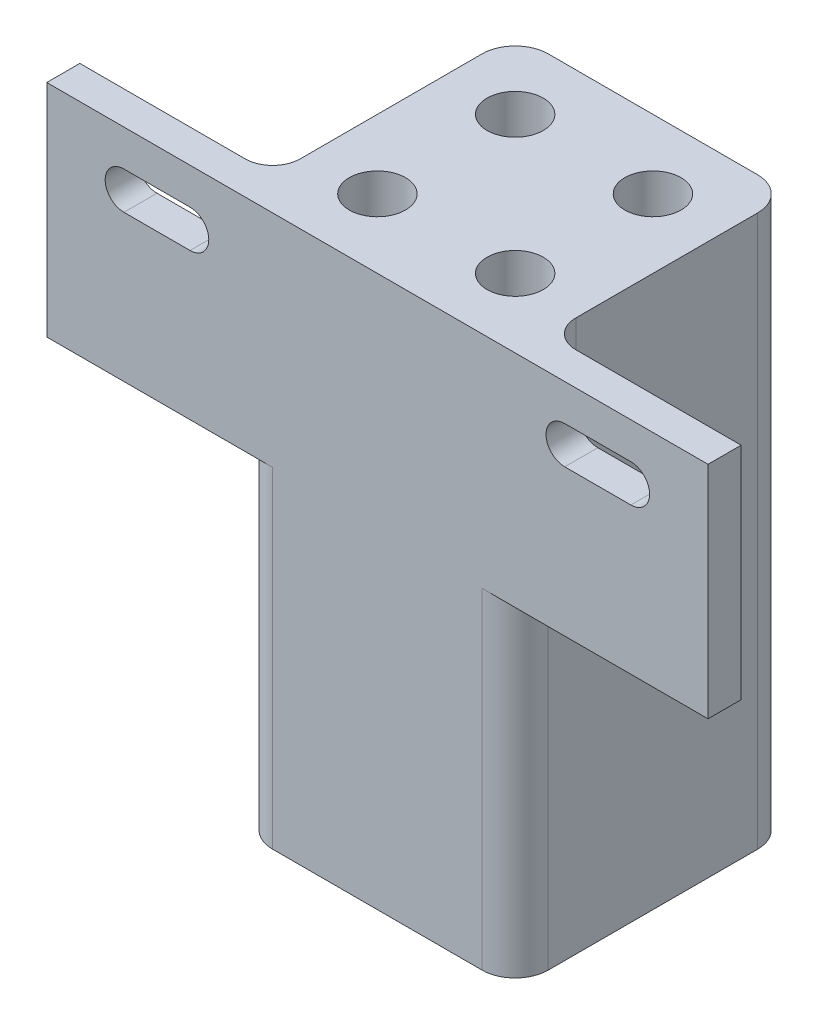
ISO-10303-21;
HEADER;
FILE_DESCRIPTION(('STEP AP214'),'2;1');
FILE_NAME('part.step','',(''),(''),'','','');
FILE_SCHEMA(('AUTOMOTIVE_DESIGN { 1 0 10303 214 1 1 1 1 }'));
ENDSEC;
DATA;
#1=APPLICATION_CONTEXT('core data for automotive mechanical design processes');
#2=APPLICATION_PROTOCOL_DEFINITION('international standard','automotive_design',2000,#1);
#3=PRODUCT_CONTEXT('',#1,'mechanical');
#4=PRODUCT('Part','Part','',(#3));
#5=PRODUCT_RELATED_PRODUCT_CATEGORY('part','',(#4));
#6=PRODUCT_DEFINITION_FORMATION('','',#4);
#7=PRODUCT_DEFINITION_CONTEXT('part definition',#1,'design');
#8=PRODUCT_DEFINITION('design','',#6,#7);
#9=PRODUCT_DEFINITION_SHAPE('','',#8);
#10=(LENGTH_UNIT() NAMED_UNIT(*) SI_UNIT(.MILLI.,.METRE.));
#11=(NAMED_UNIT(*) PLANE_ANGLE_UNIT() SI_UNIT($,.RADIAN.));
#12=(NAMED_UNIT(*) SI_UNIT($,.STERADIAN.) SOLID_ANGLE_UNIT());
#13=UNCERTAINTY_MEASURE_WITH_UNIT(LENGTH_MEASURE(1.E-05),#10,'distance_accuracy_value','');
#14=(GEOMETRIC_REPRESENTATION_CONTEXT(3) GLOBAL_UNCERTAINTY_ASSIGNED_CONTEXT((#13)) GLOBAL_UNIT_ASSIGNED_CONTEXT((#10,
#11,#12)) REPRESENTATION_CONTEXT('',''));
#15=CARTESIAN_POINT('',(0.,0.,0.));
#16=DIRECTION('',(0.,0.,1.));
#17=DIRECTION('',(1.,0.,0.));
#18=AXIS2_PLACEMENT_3D('',#15,#16,#17);
#19=CARTESIAN_POINT('',(-9.5,0.,9.49999999999999));
#20=DIRECTION('',(0.,1.,0.));
#21=DIRECTION('',(0.,0.,1.));
#22=AXIS2_PLACEMENT_3D('',#19,#20,#21);
#23=PLANE('',#22);
#24=CARTESIAN_POINT('',(-9.5,0.,9.49999999999999));
#25=DIRECTION('',(0.,1.,0.));
#26=DIRECTION('',(0.,0.,1.));
#27=AXIS2_PLACEMENT_3D('',#24,#25,#26);
#28=CIRCLE('',#27,3.);
#29=CARTESIAN_POINT('',(-12.5,0.,9.49999999999999));
#30=VERTEX_POINT('',#29);
#31=CARTESIAN_POINT('',(-9.5,0.,12.5));
#32=VERTEX_POINT('',#31);
#33=EDGE_CURVE('E347',#30,#32,#28,.T.);
#34=ORIENTED_EDGE('',*,*,#33,.F.);
#35=DIRECTION('',(0.,0.,1.));
#36=VECTOR('',#35,1.);
#37=CARTESIAN_POINT('',(-12.5,0.,-9.49999999999999));
#38=LINE('',#37,#36);
#39=CARTESIAN_POINT('',(-12.5,0.,-9.49999999999999));
#40=VERTEX_POINT('',#39);
#41=EDGE_CURVE('E351',#40,#30,#38,.T.);
#42=ORIENTED_EDGE('',*,*,#41,.F.);
#43=CARTESIAN_POINT('',(-9.5,0.,-9.49999999999999));
#44=DIRECTION('',(0.,1.,0.));
#45=DIRECTION('',(0.,0.,1.));
#46=AXIS2_PLACEMENT_3D('',#43,#44,#45);
#47=CIRCLE('',#46,3.);
#48=CARTESIAN_POINT('',(-9.5,0.,-12.5));
#49=VERTEX_POINT('',#48);
#50=EDGE_CURVE('E367',#49,#40,#47,.T.);
#51=ORIENTED_EDGE('',*,*,#50,.F.);
#52=DIRECTION('',(-1.,0.,0.));
#53=VECTOR('',#52,1.);
#54=CARTESIAN_POINT('',(-9.5,0.,-12.5));
#55=LINE('',#54,#53);
#56=CARTESIAN_POINT('',(9.5,0.,-12.5));
#57=VERTEX_POINT('',#56);
#58=EDGE_CURVE('E365',#57,#49,#55,.T.);
#59=ORIENTED_EDGE('',*,*,#58,.F.);
#60=CARTESIAN_POINT('',(9.5,0.,-9.49999999999999));
#61=DIRECTION('',(0.,1.,0.));
#62=DIRECTION('',(0.,0.,-1.));
#63=AXIS2_PLACEMENT_3D('',#60,#61,#62);
#64=CIRCLE('',#63,3.);
#65=CARTESIAN_POINT('',(12.5,0.,-9.49999999999999));
#66=VERTEX_POINT('',#65);
#67=EDGE_CURVE('E363',#66,#57,#64,.T.);
#68=ORIENTED_EDGE('',*,*,#67,.F.);
#69=DIRECTION('',(0.,0.,-1.));
#70=VECTOR('',#69,1.);
#71=CARTESIAN_POINT('',(12.5,0.,-9.49999999999999));
#72=LINE('',#71,#70);
#73=CARTESIAN_POINT('',(12.5,0.,9.49999999999999));
#74=VERTEX_POINT('',#73);
#75=EDGE_CURVE('E361',#74,#66,#72,.T.);
#76=ORIENTED_EDGE('',*,*,#75,.F.);
#77=CARTESIAN_POINT('',(9.50000000000002,0.,9.49999999999999));
#78=DIRECTION('',(0.,1.,0.));
#79=DIRECTION('',(0.,0.,1.));
#80=AXIS2_PLACEMENT_3D('',#77,#78,#79);
#81=CIRCLE('',#80,3.);
#82=CARTESIAN_POINT('',(9.50000000000002,0.,12.5));
#83=VERTEX_POINT('',#82);
#84=EDGE_CURVE('E359',#83,#74,#81,.T.);
#85=ORIENTED_EDGE('',*,*,#84,.F.);
#86=DIRECTION('',(1.,0.,0.));
#87=VECTOR('',#86,1.);
#88=CARTESIAN_POINT('',(-9.5,0.,12.5));
#89=LINE('',#88,#87);
#90=EDGE_CURVE('E357',#32,#83,#89,.T.);
#91=ORIENTED_EDGE('',*,*,#90,.F.);
#92=EDGE_LOOP('',(#34,#42,#51,#59,#68,#76,#85,#91));
#93=FACE_BOUND('',#92,.T.);
#94=CARTESIAN_POINT('',(6.25,0.,-6.25000000000001));
#95=DIRECTION('',(0.,1.,0.));
#96=DIRECTION('',(0.,0.,1.));
#97=AXIS2_PLACEMENT_3D('',#94,#95,#96);
#98=CIRCLE('',#97,2.55);
#99=CARTESIAN_POINT('',(6.25,0.,-3.70000000000001));
#100=VERTEX_POINT('',#99);
#101=EDGE_CURVE('E344',#100,#100,#98,.T.);
#102=ORIENTED_EDGE('',*,*,#101,.T.);
#103=EDGE_LOOP('',(#102));
#104=FACE_BOUND('',#103,.T.);
#105=CARTESIAN_POINT('',(-6.25,0.,-6.25));
#106=DIRECTION('',(0.,1.,0.));
#107=DIRECTION('',(0.,0.,1.));
#108=AXIS2_PLACEMENT_3D('',#105,#106,#107);
#109=CIRCLE('',#108,2.55);
#110=CARTESIAN_POINT('',(-6.25,0.,-3.7));
#111=VERTEX_POINT('',#110);
#112=EDGE_CURVE('E341',#111,#111,#109,.T.);
#113=ORIENTED_EDGE('',*,*,#112,.T.);
#114=EDGE_LOOP('',(#113));
#115=FACE_BOUND('',#114,.T.);
#116=CARTESIAN_POINT('',(-6.25,0.,6.25));
#117=DIRECTION('',(0.,1.,0.));
#118=DIRECTION('',(0.,0.,1.));
#119=AXIS2_PLACEMENT_3D('',#116,#117,#118);
#120=CIRCLE('',#119,2.55);
#121=CARTESIAN_POINT('',(-6.25,0.,8.8));
#122=VERTEX_POINT('',#121);
#123=EDGE_CURVE('E338',#122,#122,#120,.T.);
#124=ORIENTED_EDGE('',*,*,#123,.T.);
#125=EDGE_LOOP('',(#124));
#126=FACE_BOUND('',#125,.T.);
#127=CARTESIAN_POINT('',(6.25,0.,6.25));
#128=DIRECTION('',(0.,1.,0.));
#129=DIRECTION('',(0.,0.,1.));
#130=AXIS2_PLACEMENT_3D('',#127,#128,#129);
#131=CIRCLE('',#130,2.55);
#132=CARTESIAN_POINT('',(6.25,0.,8.8));
#133=VERTEX_POINT('',#132);
#134=EDGE_CURVE('E335',#133,#133,#131,.T.);
#135=ORIENTED_EDGE('',*,*,#134,.T.);
#136=EDGE_LOOP('',(#135));
#137=FACE_BOUND('',#136,.T.);
#138=ADVANCED_FACE('F36',(#93,#104,#115,#126,#137),#23,.F.);
#139=CARTESIAN_POINT('',(-9.5,30.,9.49999999999999));
#140=DIRECTION('',(0.,-1.,0.));
#141=DIRECTION('',(0.,0.,-1.));
#142=AXIS2_PLACEMENT_3D('',#139,#140,#141);
#143=CYLINDRICAL_SURFACE('',#142,3.);
#144=ORIENTED_EDGE('',*,*,#33,.T.);
#145=DIRECTION('',(0.,-1.,0.));
#146=VECTOR('',#145,1.);
#147=CARTESIAN_POINT('',(-9.5,30.,12.5));
#148=LINE('',#147,#146);
#149=CARTESIAN_POINT('',(-9.5,30.,12.5));
#150=VERTEX_POINT('',#149);
#151=EDGE_CURVE('E390',#150,#32,#148,.T.);
#152=ORIENTED_EDGE('',*,*,#151,.F.);
#153=CARTESIAN_POINT('',(-9.5,30.,9.49999999999999));
#154=DIRECTION('',(0.,1.,0.));
#155=DIRECTION('',(0.,0.,1.));
#156=AXIS2_PLACEMENT_3D('',#153,#154,#155);
#157=CIRCLE('',#156,3.);
#158=CARTESIAN_POINT('',(-12.5,30.,9.49999999999999));
#159=VERTEX_POINT('',#158);
#160=EDGE_CURVE('E348',#159,#150,#157,.T.);
#161=ORIENTED_EDGE('',*,*,#160,.F.);
#162=DIRECTION('',(0.,-1.,0.));
#163=VECTOR('',#162,1.);
#164=CARTESIAN_POINT('',(-12.5,30.,9.49999999999999));
#165=LINE('',#164,#163);
#166=EDGE_CURVE('E354',#159,#30,#165,.T.);
#167=ORIENTED_EDGE('',*,*,#166,.T.);
#168=EDGE_LOOP('',(#144,#152,#161,#167));
#169=FACE_BOUND('',#168,.T.);
#170=ADVANCED_FACE('F447',(#169),#143,.T.);
#171=CARTESIAN_POINT('',(-9.5,30.,12.5));
#172=DIRECTION('',(0.,0.,-1.));
#173=DIRECTION('',(-1.,0.,0.));
#174=AXIS2_PLACEMENT_3D('',#171,#172,#173);
#175=PLANE('',#174);
#176=DIRECTION('',(1.,0.,0.));
#177=VECTOR('',#176,1.);
#178=CARTESIAN_POINT('',(-9.5,46.7,12.5));
#179=LINE('',#178,#177);
#180=CARTESIAN_POINT('',(17.,46.7,12.5));
#181=VERTEX_POINT('',#180);
#182=CARTESIAN_POINT('',(23.,46.7,12.5));
#183=VERTEX_POINT('',#182);
#184=EDGE_CURVE('E268',#181,#183,#179,.T.);
#185=ORIENTED_EDGE('',*,*,#184,.T.);
#186=CARTESIAN_POINT('',(23.,45.,12.5));
#187=DIRECTION('',(0.,0.,-1.));
#188=DIRECTION('',(-1.,0.,0.));
#189=AXIS2_PLACEMENT_3D('',#186,#187,#188);
#190=CIRCLE('',#189,1.7);
#191=CARTESIAN_POINT('',(23.,43.3,12.5));
#192=VERTEX_POINT('',#191);
#193=EDGE_CURVE('E271',#183,#192,#190,.T.);
#194=ORIENTED_EDGE('',*,*,#193,.T.);
#195=DIRECTION('',(-1.,0.,0.));
#196=VECTOR('',#195,1.);
#197=CARTESIAN_POINT('',(-9.5,43.3,12.5));
#198=LINE('',#197,#196);
#199=CARTESIAN_POINT('',(17.,43.3,12.5));
#200=VERTEX_POINT('',#199);
#201=EDGE_CURVE('E265',#192,#200,#198,.T.);
#202=ORIENTED_EDGE('',*,*,#201,.T.);
#203=CARTESIAN_POINT('',(17.,45.,12.5));
#204=DIRECTION('',(0.,0.,-1.));
#205=DIRECTION('',(-1.,0.,0.));
#206=AXIS2_PLACEMENT_3D('',#203,#204,#205);
#207=CIRCLE('',#206,1.7);
#208=EDGE_CURVE('E207',#200,#181,#207,.T.);
#209=ORIENTED_EDGE('',*,*,#208,.T.);
#210=EDGE_LOOP('',(#185,#194,#202,#209));
#211=FACE_BOUND('',#210,.T.);
#212=DIRECTION('',(-1.,0.,0.));
#213=VECTOR('',#212,1.);
#214=CARTESIAN_POINT('',(-9.5,43.3,12.5));
#215=LINE('',#214,#213);
#216=CARTESIAN_POINT('',(-17.,43.3,12.5));
#217=VERTEX_POINT('',#216);
#218=CARTESIAN_POINT('',(-23.,43.3,12.5));
#219=VERTEX_POINT('',#218);
#220=EDGE_CURVE('E259',#217,#219,#215,.T.);
#221=ORIENTED_EDGE('',*,*,#220,.T.);
#222=CARTESIAN_POINT('',(-23.,45.,12.5));
#223=DIRECTION('',(0.,0.,-1.));
#224=DIRECTION('',(-1.,0.,0.));
#225=AXIS2_PLACEMENT_3D('',#222,#223,#224);
#226=CIRCLE('',#225,1.7);
#227=CARTESIAN_POINT('',(-23.,46.7,12.5));
#228=VERTEX_POINT('',#227);
#229=EDGE_CURVE('E262',#219,#228,#226,.T.);
#230=ORIENTED_EDGE('',*,*,#229,.T.);
#231=DIRECTION('',(1.,0.,0.));
#232=VECTOR('',#231,1.);
#233=CARTESIAN_POINT('',(-9.5,46.7,12.5));
#234=LINE('',#233,#232);
#235=CARTESIAN_POINT('',(-17.,46.7,12.5));
#236=VERTEX_POINT('',#235);
#237=EDGE_CURVE('E231',#228,#236,#234,.T.);
#238=ORIENTED_EDGE('',*,*,#237,.T.);
#239=CARTESIAN_POINT('',(-17.,45.,12.5));
#240=DIRECTION('',(0.,0.,-1.));
#241=DIRECTION('',(-1.,0.,0.));
#242=AXIS2_PLACEMENT_3D('',#239,#240,#241);
#243=CIRCLE('',#242,1.7);
#244=EDGE_CURVE('E256',#236,#217,#243,.T.);
#245=ORIENTED_EDGE('',*,*,#244,.T.);
#246=EDGE_LOOP('',(#221,#230,#238,#245));
#247=FACE_BOUND('',#246,.T.);
#248=ORIENTED_EDGE('',*,*,#90,.T.);
#249=DIRECTION('',(0.,-1.,0.));
#250=VECTOR('',#249,1.);
#251=CARTESIAN_POINT('',(9.50000000000002,30.,12.5));
#252=LINE('',#251,#250);
#253=CARTESIAN_POINT('',(9.50000000000002,30.,12.5));
#254=VERTEX_POINT('',#253);
#255=EDGE_CURVE('E387',#254,#83,#252,.T.);
#256=ORIENTED_EDGE('',*,*,#255,.F.);
#257=DIRECTION('',(1.,0.,0.));
#258=VECTOR('',#257,1.);
#259=CARTESIAN_POINT('',(-9.5,30.,12.5));
#260=LINE('',#259,#258);
#261=CARTESIAN_POINT('',(30.,30.,12.5));
#262=VERTEX_POINT('',#261);
#263=EDGE_CURVE('E321',#254,#262,#260,.T.);
#264=ORIENTED_EDGE('',*,*,#263,.T.);
#265=DIRECTION('',(0.,-1.,0.));
#266=VECTOR('',#265,1.);
#267=CARTESIAN_POINT('',(30.,50.,12.5));
#268=LINE('',#267,#266);
#269=CARTESIAN_POINT('',(30.,50.,12.5));
#270=VERTEX_POINT('',#269);
#271=EDGE_CURVE('E332',#270,#262,#268,.T.);
#272=ORIENTED_EDGE('',*,*,#271,.F.);
#273=DIRECTION('',(1.,0.,0.));
#274=VECTOR('',#273,1.);
#275=CARTESIAN_POINT('',(-9.5,50.,12.5));
#276=LINE('',#275,#274);
#277=CARTESIAN_POINT('',(-30.,50.,12.5));
#278=VERTEX_POINT('',#277);
#279=EDGE_CURVE('E287',#278,#270,#276,.T.);
#280=ORIENTED_EDGE('',*,*,#279,.F.);
#281=DIRECTION('',(0.,-1.,0.));
#282=VECTOR('',#281,1.);
#283=CARTESIAN_POINT('',(-30.,50.,12.5));
#284=LINE('',#283,#282);
#285=CARTESIAN_POINT('',(-30.,30.,12.5));
#286=VERTEX_POINT('',#285);
#287=EDGE_CURVE('E313',#278,#286,#284,.T.);
#288=ORIENTED_EDGE('',*,*,#287,.T.);
#289=EDGE_CURVE('E290',#286,#150,#260,.T.);
#290=ORIENTED_EDGE('',*,*,#289,.T.);
#291=ORIENTED_EDGE('',*,*,#151,.T.);
#292=EDGE_LOOP('',(#248,#256,#264,#272,#280,#288,#290,#291));
#293=FACE_BOUND('',#292,.T.);
#294=ADVANCED_FACE('F453',(#211,#247,#293),#175,.F.);
#295=CARTESIAN_POINT('',(9.50000000000002,30.,9.49999999999999));
#296=DIRECTION('',(0.,-1.,0.));
#297=DIRECTION('',(0.,0.,-1.));
#298=AXIS2_PLACEMENT_3D('',#295,#296,#297);
#299=CYLINDRICAL_SURFACE('',#298,3.);
#300=ORIENTED_EDGE('',*,*,#84,.T.);
#301=DIRECTION('',(0.,-1.,0.));
#302=VECTOR('',#301,1.);
#303=CARTESIAN_POINT('',(12.5,30.,9.49999999999999));
#304=LINE('',#303,#302);
#305=CARTESIAN_POINT('',(12.5,30.,9.5));
#306=VERTEX_POINT('',#305);
#307=EDGE_CURVE('E384',#306,#74,#304,.T.);
#308=ORIENTED_EDGE('',*,*,#307,.F.);
#309=CARTESIAN_POINT('',(9.50000000000002,30.,9.49999999999999));
#310=DIRECTION('',(0.,1.,0.));
#311=DIRECTION('',(0.,0.,1.));
#312=AXIS2_PLACEMENT_3D('',#309,#310,#311);
#313=CIRCLE('',#312,3.);
#314=EDGE_CURVE('E350',#254,#306,#313,.T.);
#315=ORIENTED_EDGE('',*,*,#314,.F.);
#316=ORIENTED_EDGE('',*,*,#255,.T.);
#317=EDGE_LOOP('',(#300,#308,#315,#316));
#318=FACE_BOUND('',#317,.T.);
#319=ADVANCED_FACE('F474',(#318),#299,.T.);
#320=CARTESIAN_POINT('',(12.5,30.,-9.49999999999999));
#321=DIRECTION('',(-1.,0.,0.));
#322=DIRECTION('',(0.,0.,1.));
#323=AXIS2_PLACEMENT_3D('',#320,#321,#322);
#324=PLANE('',#323);
#325=DIRECTION('',(0.,0.,-1.));
#326=VECTOR('',#325,1.);
#327=CARTESIAN_POINT('',(12.5,50.,9.5));
#328=LINE('',#327,#326);
#329=CARTESIAN_POINT('',(12.5,50.,7.));
#330=VERTEX_POINT('',#329);
#331=CARTESIAN_POINT('',(12.5,50.,-9.49999999999999));
#332=VERTEX_POINT('',#331);
#333=EDGE_CURVE('E294',#330,#332,#328,.T.);
#334=ORIENTED_EDGE('',*,*,#333,.F.);
#335=DIRECTION('',(0.,-1.,0.));
#336=VECTOR('',#335,1.);
#337=CARTESIAN_POINT('',(12.5,30.,7.));
#338=LINE('',#337,#336);
#339=CARTESIAN_POINT('',(12.5,30.,7.));
#340=VERTEX_POINT('',#339);
#341=EDGE_CURVE('E401',#330,#340,#338,.T.);
#342=ORIENTED_EDGE('',*,*,#341,.T.);
#343=DIRECTION('',(0.,0.,1.));
#344=VECTOR('',#343,1.);
#345=CARTESIAN_POINT('',(12.5,30.,-9.5));
#346=LINE('',#345,#344);
#347=EDGE_CURVE('E399',#340,#306,#346,.T.);
#348=ORIENTED_EDGE('',*,*,#347,.T.);
#349=ORIENTED_EDGE('',*,*,#307,.T.);
#350=ORIENTED_EDGE('',*,*,#75,.T.);
#351=DIRECTION('',(0.,-1.,0.));
#352=VECTOR('',#351,1.);
#353=CARTESIAN_POINT('',(12.5,30.,-9.49999999999999));
#354=LINE('',#353,#352);
#355=EDGE_CURVE('E381',#332,#66,#354,.T.);
#356=ORIENTED_EDGE('',*,*,#355,.F.);
#357=EDGE_LOOP('',(#334,#342,#348,#349,#350,#356));
#358=FACE_BOUND('',#357,.T.);
#359=ADVANCED_FACE('F424',(#358),#324,.F.);
#360=CARTESIAN_POINT('',(9.5,30.,-9.49999999999999));
#361=DIRECTION('',(0.,-1.,0.));
#362=DIRECTION('',(0.,0.,-1.));
#363=AXIS2_PLACEMENT_3D('',#360,#361,#362);
#364=CYLINDRICAL_SURFACE('',#363,3.);
#365=ORIENTED_EDGE('',*,*,#67,.T.);
#366=DIRECTION('',(0.,-1.,0.));
#367=VECTOR('',#366,1.);
#368=CARTESIAN_POINT('',(9.5,30.,-12.5));
#369=LINE('',#368,#367);
#370=CARTESIAN_POINT('',(9.5,50.,-12.5));
#371=VERTEX_POINT('',#370);
#372=EDGE_CURVE('E378',#371,#57,#369,.T.);
#373=ORIENTED_EDGE('',*,*,#372,.F.);
#374=CARTESIAN_POINT('',(9.5,50.,-9.49999999999999));
#375=DIRECTION('',(0.,1.,0.));
#376=DIRECTION('',(0.,0.,1.));
#377=AXIS2_PLACEMENT_3D('',#374,#375,#376);
#378=CIRCLE('',#377,3.);
#379=EDGE_CURVE('E296',#332,#371,#378,.T.);
#380=ORIENTED_EDGE('',*,*,#379,.F.);
#381=ORIENTED_EDGE('',*,*,#355,.T.);
#382=EDGE_LOOP('',(#365,#373,#380,#381));
#383=FACE_BOUND('',#382,.T.);
#384=ADVANCED_FACE('F429',(#383),#364,.T.);
#385=CARTESIAN_POINT('',(-9.5,30.,-12.5));
#386=DIRECTION('',(0.,0.,1.));
#387=DIRECTION('',(1.,0.,0.));
#388=AXIS2_PLACEMENT_3D('',#385,#386,#387);
#389=PLANE('',#388);
#390=ORIENTED_EDGE('',*,*,#58,.T.);
#391=DIRECTION('',(0.,-1.,0.));
#392=VECTOR('',#391,1.);
#393=CARTESIAN_POINT('',(-9.5,30.,-12.5));
#394=LINE('',#393,#392);
#395=CARTESIAN_POINT('',(-9.5,50.,-12.5));
#396=VERTEX_POINT('',#395);
#397=EDGE_CURVE('E375',#396,#49,#394,.T.);
#398=ORIENTED_EDGE('',*,*,#397,.F.);
#399=DIRECTION('',(-1.,0.,0.));
#400=VECTOR('',#399,1.);
#401=CARTESIAN_POINT('',(9.5,50.,-12.5));
#402=LINE('',#401,#400);
#403=EDGE_CURVE('E299',#371,#396,#402,.T.);
#404=ORIENTED_EDGE('',*,*,#403,.F.);
#405=ORIENTED_EDGE('',*,*,#372,.T.);
#406=EDGE_LOOP('',(#390,#398,#404,#405));
#407=FACE_BOUND('',#406,.T.);
#408=ADVANCED_FACE('F433',(#407),#389,.F.);
#409=CARTESIAN_POINT('',(-9.5,30.,-9.49999999999999));
#410=DIRECTION('',(0.,-1.,0.));
#411=DIRECTION('',(0.,0.,-1.));
#412=AXIS2_PLACEMENT_3D('',#409,#410,#411);
#413=CYLINDRICAL_SURFACE('',#412,3.);
#414=ORIENTED_EDGE('',*,*,#50,.T.);
#415=DIRECTION('',(0.,-1.,0.));
#416=VECTOR('',#415,1.);
#417=CARTESIAN_POINT('',(-12.5,30.,-9.49999999999999));
#418=LINE('',#417,#416);
#419=CARTESIAN_POINT('',(-12.5,50.,-9.49999999999999));
#420=VERTEX_POINT('',#419);
#421=EDGE_CURVE('E372',#420,#40,#418,.T.);
#422=ORIENTED_EDGE('',*,*,#421,.F.);
#423=CARTESIAN_POINT('',(-9.5,50.,-9.49999999999999));
#424=DIRECTION('',(0.,1.,0.));
#425=DIRECTION('',(0.,0.,1.));
#426=AXIS2_PLACEMENT_3D('',#423,#424,#425);
#427=CIRCLE('',#426,3.);
#428=EDGE_CURVE('E302',#396,#420,#427,.T.);
#429=ORIENTED_EDGE('',*,*,#428,.F.);
#430=ORIENTED_EDGE('',*,*,#397,.T.);
#431=EDGE_LOOP('',(#414,#422,#429,#430));
#432=FACE_BOUND('',#431,.T.);
#433=ADVANCED_FACE('F437',(#432),#413,.T.);
#434=CARTESIAN_POINT('',(-12.5,30.,-9.49999999999999));
#435=DIRECTION('',(1.,0.,0.));
#436=DIRECTION('',(0.,0.,-1.));
#437=AXIS2_PLACEMENT_3D('',#434,#435,#436);
#438=PLANE('',#437);
#439=ORIENTED_EDGE('',*,*,#166,.F.);
#440=DIRECTION('',(0.,0.,-1.));
#441=VECTOR('',#440,1.);
#442=CARTESIAN_POINT('',(-12.5,30.,-9.49999999999999));
#443=LINE('',#442,#441);
#444=CARTESIAN_POINT('',(-12.5,30.,7.));
#445=VERTEX_POINT('',#444);
#446=EDGE_CURVE('E51',#159,#445,#443,.T.);
#447=ORIENTED_EDGE('',*,*,#446,.T.);
#448=DIRECTION('',(0.,-1.,0.));
#449=VECTOR('',#448,1.);
#450=CARTESIAN_POINT('',(-12.5,50.,7.));
#451=LINE('',#450,#449);
#452=CARTESIAN_POINT('',(-12.5,50.,7.));
#453=VERTEX_POINT('',#452);
#454=EDGE_CURVE('E396',#445,#453,#451,.F.);
#455=ORIENTED_EDGE('',*,*,#454,.T.);
#456=DIRECTION('',(0.,0.,1.));
#457=VECTOR('',#456,1.);
#458=CARTESIAN_POINT('',(-12.5,50.,-9.49999999999999));
#459=LINE('',#458,#457);
#460=EDGE_CURVE('E305',#420,#453,#459,.T.);
#461=ORIENTED_EDGE('',*,*,#460,.F.);
#462=ORIENTED_EDGE('',*,*,#421,.T.);
#463=ORIENTED_EDGE('',*,*,#41,.T.);
#464=EDGE_LOOP('',(#439,#447,#455,#461,#462,#463));
#465=FACE_BOUND('',#464,.T.);
#466=ADVANCED_FACE('F443',(#465),#438,.F.);
#467=CARTESIAN_POINT('',(6.25,30.,-6.25000000000001));
#468=DIRECTION('',(0.,-1.,0.));
#469=DIRECTION('',(0.,0.,-1.));
#470=AXIS2_PLACEMENT_3D('',#467,#468,#469);
#471=CYLINDRICAL_SURFACE('',#470,2.55);
#472=ORIENTED_EDGE('',*,*,#101,.F.);
#473=EDGE_LOOP('',(#472));
#474=FACE_BOUND('',#473,.T.);
#475=CARTESIAN_POINT('',(6.25,50.,-6.25000000000001));
#476=DIRECTION('',(0.,1.,0.));
#477=DIRECTION('',(0.,0.,1.));
#478=AXIS2_PLACEMENT_3D('',#475,#476,#477);
#479=CIRCLE('',#478,2.55);
#480=CARTESIAN_POINT('',(6.25,50.,-3.70000000000001));
#481=VERTEX_POINT('',#480);
#482=EDGE_CURVE('E280',#481,#481,#479,.T.);
#483=ORIENTED_EDGE('',*,*,#482,.T.);
#484=EDGE_LOOP('',(#483));
#485=FACE_BOUND('',#484,.T.);
#486=ADVANCED_FACE('F493',(#474,#485),#471,.F.);
#487=CARTESIAN_POINT('',(-6.25,30.,-6.25));
#488=DIRECTION('',(0.,-1.,0.));
#489=DIRECTION('',(0.,0.,-1.));
#490=AXIS2_PLACEMENT_3D('',#487,#488,#489);
#491=CYLINDRICAL_SURFACE('',#490,2.55);
#492=ORIENTED_EDGE('',*,*,#112,.F.);
#493=EDGE_LOOP('',(#492));
#494=FACE_BOUND('',#493,.T.);
#495=CARTESIAN_POINT('',(-6.25,50.,-6.25));
#496=DIRECTION('',(0.,1.,0.));
#497=DIRECTION('',(0.,0.,1.));
#498=AXIS2_PLACEMENT_3D('',#495,#496,#497);
#499=CIRCLE('',#498,2.55);
#500=CARTESIAN_POINT('',(-6.25,50.,-3.7));
#501=VERTEX_POINT('',#500);
#502=EDGE_CURVE('E283',#501,#501,#499,.T.);
#503=ORIENTED_EDGE('',*,*,#502,.T.);
#504=EDGE_LOOP('',(#503));
#505=FACE_BOUND('',#504,.T.);
#506=ADVANCED_FACE('F525',(#494,#505),#491,.F.);
#507=CARTESIAN_POINT('',(-6.25,30.,6.25));
#508=DIRECTION('',(0.,-1.,0.));
#509=DIRECTION('',(0.,0.,-1.));
#510=AXIS2_PLACEMENT_3D('',#507,#508,#509);
#511=CYLINDRICAL_SURFACE('',#510,2.55);
#512=ORIENTED_EDGE('',*,*,#123,.F.);
#513=EDGE_LOOP('',(#512));
#514=FACE_BOUND('',#513,.T.);
#515=CARTESIAN_POINT('',(-6.25,50.,6.25));
#516=DIRECTION('',(0.,1.,0.));
#517=DIRECTION('',(0.,0.,1.));
#518=AXIS2_PLACEMENT_3D('',#515,#516,#517);
#519=CIRCLE('',#518,2.55);
#520=CARTESIAN_POINT('',(-6.25,50.,8.8));
#521=VERTEX_POINT('',#520);
#522=EDGE_CURVE('E277',#521,#521,#519,.T.);
#523=ORIENTED_EDGE('',*,*,#522,.T.);
#524=EDGE_LOOP('',(#523));
#525=FACE_BOUND('',#524,.T.);
#526=ADVANCED_FACE('F532',(#514,#525),#511,.F.);
#527=CARTESIAN_POINT('',(6.25,30.,6.25));
#528=DIRECTION('',(0.,-1.,0.));
#529=DIRECTION('',(0.,0.,-1.));
#530=AXIS2_PLACEMENT_3D('',#527,#528,#529);
#531=CYLINDRICAL_SURFACE('',#530,2.55);
#532=ORIENTED_EDGE('',*,*,#134,.F.);
#533=EDGE_LOOP('',(#532));
#534=FACE_BOUND('',#533,.T.);
#535=CARTESIAN_POINT('',(6.25,50.,6.25));
#536=DIRECTION('',(0.,1.,0.));
#537=DIRECTION('',(0.,0.,1.));
#538=AXIS2_PLACEMENT_3D('',#535,#536,#537);
#539=CIRCLE('',#538,2.55);
#540=CARTESIAN_POINT('',(6.25,50.,8.8));
#541=VERTEX_POINT('',#540);
#542=EDGE_CURVE('E274',#541,#541,#539,.T.);
#543=ORIENTED_EDGE('',*,*,#542,.T.);
#544=EDGE_LOOP('',(#543));
#545=FACE_BOUND('',#544,.T.);
#546=ADVANCED_FACE('F539',(#534,#545),#531,.F.);
#547=CARTESIAN_POINT('',(9.5,30.,-9.49999999999999));
#548=DIRECTION('',(0.,1.,0.));
#549=DIRECTION('',(0.,0.,1.));
#550=AXIS2_PLACEMENT_3D('',#547,#548,#549);
#551=PLANE('',#550);
#552=DIRECTION('',(-1.,0.,0.));
#553=VECTOR('',#552,1.);
#554=CARTESIAN_POINT('',(-30.,30.,9.5));
#555=LINE('',#554,#553);
#556=CARTESIAN_POINT('',(-15.,30.,9.5));
#557=VERTEX_POINT('',#556);
#558=CARTESIAN_POINT('',(-30.,30.,9.5));
#559=VERTEX_POINT('',#558);
#560=EDGE_CURVE('E317',#557,#559,#555,.T.);
#561=ORIENTED_EDGE('',*,*,#560,.F.);
#562=CARTESIAN_POINT('',(-15.,30.,7.));
#563=DIRECTION('',(0.,1.,0.));
#564=DIRECTION('',(0.,0.,1.));
#565=AXIS2_PLACEMENT_3D('',#562,#563,#564);
#566=CIRCLE('',#565,2.5);
#567=EDGE_CURVE('E405',#557,#445,#566,.T.);
#568=ORIENTED_EDGE('',*,*,#567,.T.);
#569=ORIENTED_EDGE('',*,*,#446,.F.);
#570=ORIENTED_EDGE('',*,*,#160,.T.);
#571=ORIENTED_EDGE('',*,*,#289,.F.);
#572=DIRECTION('',(0.,0.,1.));
#573=VECTOR('',#572,1.);
#574=CARTESIAN_POINT('',(-30.,30.,12.5));
#575=LINE('',#574,#573);
#576=EDGE_CURVE('E319',#559,#286,#575,.T.);
#577=ORIENTED_EDGE('',*,*,#576,.F.);
#578=EDGE_LOOP('',(#561,#568,#569,#570,#571,#577));
#579=FACE_BOUND('',#578,.T.);
#580=ADVANCED_FACE('F450',(#579),#551,.F.);
#581=ORIENTED_EDGE('',*,*,#263,.F.);
#582=ORIENTED_EDGE('',*,*,#314,.T.);
#583=ORIENTED_EDGE('',*,*,#347,.F.);
#584=CARTESIAN_POINT('',(15.,30.,7.));
#585=DIRECTION('',(0.,1.,0.));
#586=DIRECTION('',(0.,0.,1.));
#587=AXIS2_PLACEMENT_3D('',#584,#585,#586);
#588=CIRCLE('',#587,2.5);
#589=CARTESIAN_POINT('',(15.,30.,9.5));
#590=VERTEX_POINT('',#589);
#591=EDGE_CURVE('E44',#340,#590,#588,.T.);
#592=ORIENTED_EDGE('',*,*,#591,.T.);
#593=DIRECTION('',(-1.,0.,0.));
#594=VECTOR('',#593,1.);
#595=CARTESIAN_POINT('',(30.,30.,9.49999999999999));
#596=LINE('',#595,#594);
#597=CARTESIAN_POINT('',(30.,30.,9.49999999999999));
#598=VERTEX_POINT('',#597);
#599=EDGE_CURVE('E315',#598,#590,#596,.T.);
#600=ORIENTED_EDGE('',*,*,#599,.F.);
#601=DIRECTION('',(0.,0.,-1.));
#602=VECTOR('',#601,1.);
#603=CARTESIAN_POINT('',(30.,30.,12.5));
#604=LINE('',#603,#602);
#605=EDGE_CURVE('E286',#262,#598,#604,.T.);
#606=ORIENTED_EDGE('',*,*,#605,.F.);
#607=EDGE_LOOP('',(#581,#582,#583,#592,#600,#606));
#608=FACE_BOUND('',#607,.T.);
#609=ADVANCED_FACE('F412',(#608),#551,.F.);
#610=CARTESIAN_POINT('',(9.5,50.,-9.49999999999999));
#611=DIRECTION('',(0.,1.,0.));
#612=DIRECTION('',(0.,0.,1.));
#613=AXIS2_PLACEMENT_3D('',#610,#611,#612);
#614=PLANE('',#613);
#615=ORIENTED_EDGE('',*,*,#522,.F.);
#616=EDGE_LOOP('',(#615));
#617=FACE_BOUND('',#616,.T.);
#618=ORIENTED_EDGE('',*,*,#502,.F.);
#619=EDGE_LOOP('',(#618));
#620=FACE_BOUND('',#619,.T.);
#621=ORIENTED_EDGE('',*,*,#279,.T.);
#622=DIRECTION('',(0.,0.,-1.));
#623=VECTOR('',#622,1.);
#624=CARTESIAN_POINT('',(30.,50.,12.5));
#625=LINE('',#624,#623);
#626=CARTESIAN_POINT('',(30.,50.,9.49999999999999));
#627=VERTEX_POINT('',#626);
#628=EDGE_CURVE('E289',#270,#627,#625,.T.);
#629=ORIENTED_EDGE('',*,*,#628,.T.);
#630=DIRECTION('',(-1.,0.,0.));
#631=VECTOR('',#630,1.);
#632=CARTESIAN_POINT('',(30.,50.,9.49999999999999));
#633=LINE('',#632,#631);
#634=CARTESIAN_POINT('',(15.,50.,9.5));
#635=VERTEX_POINT('',#634);
#636=EDGE_CURVE('E292',#627,#635,#633,.T.);
#637=ORIENTED_EDGE('',*,*,#636,.T.);
#638=CARTESIAN_POINT('',(15.,50.,7.));
#639=DIRECTION('',(0.,1.,0.));
#640=DIRECTION('',(0.,0.,1.));
#641=AXIS2_PLACEMENT_3D('',#638,#639,#640);
#642=CIRCLE('',#641,2.5);
#643=EDGE_CURVE('E11',#635,#330,#642,.F.);
#644=ORIENTED_EDGE('',*,*,#643,.T.);
#645=ORIENTED_EDGE('',*,*,#333,.T.);
#646=ORIENTED_EDGE('',*,*,#379,.T.);
#647=ORIENTED_EDGE('',*,*,#403,.T.);
#648=ORIENTED_EDGE('',*,*,#428,.T.);
#649=ORIENTED_EDGE('',*,*,#460,.T.);
#650=CARTESIAN_POINT('',(-15.,50.,7.));
#651=DIRECTION('',(0.,1.,0.));
#652=DIRECTION('',(0.,0.,1.));
#653=AXIS2_PLACEMENT_3D('',#650,#651,#652);
#654=CIRCLE('',#653,2.5);
#655=CARTESIAN_POINT('',(-15.,50.,9.5));
#656=VERTEX_POINT('',#655);
#657=EDGE_CURVE('E407',#453,#656,#654,.F.);
#658=ORIENTED_EDGE('',*,*,#657,.T.);
#659=DIRECTION('',(-1.,0.,0.));
#660=VECTOR('',#659,1.);
#661=CARTESIAN_POINT('',(-30.,50.,9.5));
#662=LINE('',#661,#660);
#663=CARTESIAN_POINT('',(-30.,50.,9.5));
#664=VERTEX_POINT('',#663);
#665=EDGE_CURVE('E308',#656,#664,#662,.T.);
#666=ORIENTED_EDGE('',*,*,#665,.T.);
#667=DIRECTION('',(0.,0.,1.));
#668=VECTOR('',#667,1.);
#669=CARTESIAN_POINT('',(-30.,50.,12.5));
#670=LINE('',#669,#668);
#671=EDGE_CURVE('E310',#664,#278,#670,.T.);
#672=ORIENTED_EDGE('',*,*,#671,.T.);
#673=EDGE_LOOP('',(#621,#629,#637,#644,#645,#646,#647,#648,#649,#658,#666,#672));
#674=FACE_BOUND('',#673,.T.);
#675=ORIENTED_EDGE('',*,*,#482,.F.);
#676=EDGE_LOOP('',(#675));
#677=FACE_BOUND('',#676,.T.);
#678=ORIENTED_EDGE('',*,*,#542,.F.);
#679=EDGE_LOOP('',(#678));
#680=FACE_BOUND('',#679,.T.);
#681=ADVANCED_FACE('F420',(#617,#620,#674,#677,#680),#614,.T.);
#682=CARTESIAN_POINT('',(30.,50.,12.5));
#683=DIRECTION('',(-1.,0.,0.));
#684=DIRECTION('',(0.,0.,1.));
#685=AXIS2_PLACEMENT_3D('',#682,#683,#684);
#686=PLANE('',#685);
#687=ORIENTED_EDGE('',*,*,#605,.T.);
#688=DIRECTION('',(0.,-1.,0.));
#689=VECTOR('',#688,1.);
#690=CARTESIAN_POINT('',(30.,50.,9.49999999999999));
#691=LINE('',#690,#689);
#692=EDGE_CURVE('E329',#627,#598,#691,.T.);
#693=ORIENTED_EDGE('',*,*,#692,.F.);
#694=ORIENTED_EDGE('',*,*,#628,.F.);
#695=ORIENTED_EDGE('',*,*,#271,.T.);
#696=EDGE_LOOP('',(#687,#693,#694,#695));
#697=FACE_BOUND('',#696,.T.);
#698=ADVANCED_FACE('F470',(#697),#686,.F.);
#699=CARTESIAN_POINT('',(30.,50.,9.49999999999999));
#700=DIRECTION('',(0.,0.,1.));
#701=DIRECTION('',(1.,0.,0.));
#702=AXIS2_PLACEMENT_3D('',#699,#700,#701);
#703=PLANE('',#702);
#704=DIRECTION('',(-1.,0.,0.));
#705=VECTOR('',#704,1.);
#706=CARTESIAN_POINT('',(23.,43.3,9.49999999999999));
#707=LINE('',#706,#705);
#708=CARTESIAN_POINT('',(23.,43.3,9.49999999999999));
#709=VERTEX_POINT('',#708);
#710=CARTESIAN_POINT('',(17.,43.3,9.5));
#711=VERTEX_POINT('',#710);
#712=EDGE_CURVE('E215',#709,#711,#707,.T.);
#713=ORIENTED_EDGE('',*,*,#712,.F.);
#714=CARTESIAN_POINT('',(23.,45.,9.49999999999999));
#715=DIRECTION('',(0.,0.,-1.));
#716=DIRECTION('',(-1.,0.,0.));
#717=AXIS2_PLACEMENT_3D('',#714,#715,#716);
#718=CIRCLE('',#717,1.7);
#719=CARTESIAN_POINT('',(23.,46.7,9.49999999999999));
#720=VERTEX_POINT('',#719);
#721=EDGE_CURVE('E220',#720,#709,#718,.T.);
#722=ORIENTED_EDGE('',*,*,#721,.F.);
#723=DIRECTION('',(1.,0.,0.));
#724=VECTOR('',#723,1.);
#725=CARTESIAN_POINT('',(23.,46.7,9.49999999999999));
#726=LINE('',#725,#724);
#727=CARTESIAN_POINT('',(17.,46.7,9.5));
#728=VERTEX_POINT('',#727);
#729=EDGE_CURVE('E224',#728,#720,#726,.T.);
#730=ORIENTED_EDGE('',*,*,#729,.F.);
#731=CARTESIAN_POINT('',(17.,45.,9.5));
#732=DIRECTION('',(0.,0.,-1.));
#733=DIRECTION('',(-1.,0.,0.));
#734=AXIS2_PLACEMENT_3D('',#731,#732,#733);
#735=CIRCLE('',#734,1.7);
#736=EDGE_CURVE('E204',#711,#728,#735,.T.);
#737=ORIENTED_EDGE('',*,*,#736,.F.);
#738=EDGE_LOOP('',(#713,#722,#730,#737));
#739=FACE_BOUND('',#738,.T.);
#740=ORIENTED_EDGE('',*,*,#599,.T.);
#741=DIRECTION('',(0.,-1.,0.));
#742=VECTOR('',#741,1.);
#743=CARTESIAN_POINT('',(15.,50.,9.5));
#744=LINE('',#743,#742);
#745=EDGE_CURVE('E59',#590,#635,#744,.F.);
#746=ORIENTED_EDGE('',*,*,#745,.T.);
#747=ORIENTED_EDGE('',*,*,#636,.F.);
#748=ORIENTED_EDGE('',*,*,#692,.T.);
#749=EDGE_LOOP('',(#740,#746,#747,#748));
#750=FACE_BOUND('',#749,.T.);
#751=ADVANCED_FACE('F222',(#739,#750),#703,.F.);
#752=CARTESIAN_POINT('',(-30.,50.,9.5));
#753=DIRECTION('',(0.,0.,1.));
#754=DIRECTION('',(1.,0.,0.));
#755=AXIS2_PLACEMENT_3D('',#752,#753,#754);
#756=PLANE('',#755);
#757=DIRECTION('',(1.,0.,0.));
#758=VECTOR('',#757,1.);
#759=CARTESIAN_POINT('',(-23.,46.7,9.50000000000002));
#760=LINE('',#759,#758);
#761=CARTESIAN_POINT('',(-23.,46.7,9.5));
#762=VERTEX_POINT('',#761);
#763=CARTESIAN_POINT('',(-17.,46.7,9.50000000000002));
#764=VERTEX_POINT('',#763);
#765=EDGE_CURVE('E236',#762,#764,#760,.T.);
#766=ORIENTED_EDGE('',*,*,#765,.F.);
#767=CARTESIAN_POINT('',(-23.,45.,9.50000000000002));
#768=DIRECTION('',(0.,0.,-1.));
#769=DIRECTION('',(-1.,0.,0.));
#770=AXIS2_PLACEMENT_3D('',#767,#768,#769);
#771=CIRCLE('',#770,1.7);
#772=CARTESIAN_POINT('',(-23.,43.3,9.50000000000002));
#773=VERTEX_POINT('',#772);
#774=EDGE_CURVE('E234',#773,#762,#771,.T.);
#775=ORIENTED_EDGE('',*,*,#774,.F.);
#776=DIRECTION('',(-1.,0.,0.));
#777=VECTOR('',#776,1.);
#778=CARTESIAN_POINT('',(-23.,43.3,9.50000000000002));
#779=LINE('',#778,#777);
#780=CARTESIAN_POINT('',(-17.,43.3,9.50000000000002));
#781=VERTEX_POINT('',#780);
#782=EDGE_CURVE('E242',#781,#773,#779,.T.);
#783=ORIENTED_EDGE('',*,*,#782,.F.);
#784=CARTESIAN_POINT('',(-17.,45.,9.50000000000002));
#785=DIRECTION('',(0.,0.,-1.));
#786=DIRECTION('',(-1.,0.,0.));
#787=AXIS2_PLACEMENT_3D('',#784,#785,#786);
#788=CIRCLE('',#787,1.7);
#789=EDGE_CURVE('E239',#764,#781,#788,.T.);
#790=ORIENTED_EDGE('',*,*,#789,.F.);
#791=EDGE_LOOP('',(#766,#775,#783,#790));
#792=FACE_BOUND('',#791,.T.);
#793=ORIENTED_EDGE('',*,*,#665,.F.);
#794=DIRECTION('',(0.,-1.,0.));
#795=VECTOR('',#794,1.);
#796=CARTESIAN_POINT('',(-15.,30.,9.5));
#797=LINE('',#796,#795);
#798=EDGE_CURVE('E393',#656,#557,#797,.T.);
#799=ORIENTED_EDGE('',*,*,#798,.T.);
#800=ORIENTED_EDGE('',*,*,#560,.T.);
#801=DIRECTION('',(0.,-1.,0.));
#802=VECTOR('',#801,1.);
#803=CARTESIAN_POINT('',(-30.,50.,9.5));
#804=LINE('',#803,#802);
#805=EDGE_CURVE('E326',#664,#559,#804,.T.);
#806=ORIENTED_EDGE('',*,*,#805,.F.);
#807=EDGE_LOOP('',(#793,#799,#800,#806));
#808=FACE_BOUND('',#807,.T.);
#809=ADVANCED_FACE('F462',(#792,#808),#756,.F.);
#810=CARTESIAN_POINT('',(-30.,50.,12.5));
#811=DIRECTION('',(1.,0.,0.));
#812=DIRECTION('',(0.,0.,-1.));
#813=AXIS2_PLACEMENT_3D('',#810,#811,#812);
#814=PLANE('',#813);
#815=ORIENTED_EDGE('',*,*,#576,.T.);
#816=ORIENTED_EDGE('',*,*,#287,.F.);
#817=ORIENTED_EDGE('',*,*,#671,.F.);
#818=ORIENTED_EDGE('',*,*,#805,.T.);
#819=EDGE_LOOP('',(#815,#816,#817,#818));
#820=FACE_BOUND('',#819,.T.);
#821=ADVANCED_FACE('F458',(#820),#814,.F.);
#822=CARTESIAN_POINT('',(-23.,45.,29.5));
#823=DIRECTION('',(0.,0.,-1.));
#824=DIRECTION('',(-1.,0.,0.));
#825=AXIS2_PLACEMENT_3D('',#822,#823,#824);
#826=CYLINDRICAL_SURFACE('',#825,1.7);
#827=DIRECTION('',(0.,0.,-1.));
#828=VECTOR('',#827,1.);
#829=CARTESIAN_POINT('',(-23.,43.3,29.5));
#830=LINE('',#829,#828);
#831=EDGE_CURVE('E246',#219,#773,#830,.T.);
#832=ORIENTED_EDGE('',*,*,#831,.T.);
#833=ORIENTED_EDGE('',*,*,#774,.T.);
#834=DIRECTION('',(0.,0.,-1.));
#835=VECTOR('',#834,1.);
#836=CARTESIAN_POINT('',(-23.,46.7,29.5));
#837=LINE('',#836,#835);
#838=EDGE_CURVE('E245',#228,#762,#837,.T.);
#839=ORIENTED_EDGE('',*,*,#838,.F.);
#840=ORIENTED_EDGE('',*,*,#229,.F.);
#841=EDGE_LOOP('',(#832,#833,#839,#840));
#842=FACE_BOUND('',#841,.T.);
#843=ADVANCED_FACE('F591',(#842),#826,.F.);
#844=CARTESIAN_POINT('',(-23.,43.3,29.5));
#845=DIRECTION('',(0.,-1.,0.));
#846=DIRECTION('',(0.,0.,-1.));
#847=AXIS2_PLACEMENT_3D('',#844,#845,#846);
#848=PLANE('',#847);
#849=DIRECTION('',(0.,0.,-1.));
#850=VECTOR('',#849,1.);
#851=CARTESIAN_POINT('',(-17.,43.3,29.5));
#852=LINE('',#851,#850);
#853=EDGE_CURVE('E248',#217,#781,#852,.T.);
#854=ORIENTED_EDGE('',*,*,#853,.T.);
#855=ORIENTED_EDGE('',*,*,#782,.T.);
#856=ORIENTED_EDGE('',*,*,#831,.F.);
#857=ORIENTED_EDGE('',*,*,#220,.F.);
#858=EDGE_LOOP('',(#854,#855,#856,#857));
#859=FACE_BOUND('',#858,.T.);
#860=ADVANCED_FACE('F599',(#859),#848,.F.);
#861=CARTESIAN_POINT('',(-17.,45.,29.5));
#862=DIRECTION('',(0.,0.,-1.));
#863=DIRECTION('',(-1.,0.,0.));
#864=AXIS2_PLACEMENT_3D('',#861,#862,#863);
#865=CYLINDRICAL_SURFACE('',#864,1.7);
#866=DIRECTION('',(0.,0.,-1.));
#867=VECTOR('',#866,1.);
#868=CARTESIAN_POINT('',(-17.,46.7,29.5));
#869=LINE('',#868,#867);
#870=EDGE_CURVE('E250',#236,#764,#869,.T.);
#871=ORIENTED_EDGE('',*,*,#870,.T.);
#872=ORIENTED_EDGE('',*,*,#789,.T.);
#873=ORIENTED_EDGE('',*,*,#853,.F.);
#874=ORIENTED_EDGE('',*,*,#244,.F.);
#875=EDGE_LOOP('',(#871,#872,#873,#874));
#876=FACE_BOUND('',#875,.T.);
#877=ADVANCED_FACE('F607',(#876),#865,.F.);
#878=CARTESIAN_POINT('',(-23.,46.7,29.5));
#879=DIRECTION('',(0.,1.,0.));
#880=DIRECTION('',(0.,0.,1.));
#881=AXIS2_PLACEMENT_3D('',#878,#879,#880);
#882=PLANE('',#881);
#883=ORIENTED_EDGE('',*,*,#838,.T.);
#884=ORIENTED_EDGE('',*,*,#765,.T.);
#885=ORIENTED_EDGE('',*,*,#870,.F.);
#886=ORIENTED_EDGE('',*,*,#237,.F.);
#887=EDGE_LOOP('',(#883,#884,#885,#886));
#888=FACE_BOUND('',#887,.T.);
#889=ADVANCED_FACE('F615',(#888),#882,.F.);
#890=CARTESIAN_POINT('',(23.,45.,29.5));
#891=DIRECTION('',(0.,0.,-1.));
#892=DIRECTION('',(-1.,0.,0.));
#893=AXIS2_PLACEMENT_3D('',#890,#891,#892);
#894=CYLINDRICAL_SURFACE('',#893,1.7);
#895=DIRECTION('',(0.,0.,-1.));
#896=VECTOR('',#895,1.);
#897=CARTESIAN_POINT('',(23.,46.7,29.5));
#898=LINE('',#897,#896);
#899=EDGE_CURVE('E229',#183,#720,#898,.T.);
#900=ORIENTED_EDGE('',*,*,#899,.T.);
#901=ORIENTED_EDGE('',*,*,#721,.T.);
#902=DIRECTION('',(0.,0.,-1.));
#903=VECTOR('',#902,1.);
#904=CARTESIAN_POINT('',(23.,43.3,29.5));
#905=LINE('',#904,#903);
#906=EDGE_CURVE('E211',#192,#709,#905,.T.);
#907=ORIENTED_EDGE('',*,*,#906,.F.);
#908=ORIENTED_EDGE('',*,*,#193,.F.);
#909=EDGE_LOOP('',(#900,#901,#907,#908));
#910=FACE_BOUND('',#909,.T.);
#911=ADVANCED_FACE('F623',(#910),#894,.F.);
#912=CARTESIAN_POINT('',(23.,46.7,29.5));
#913=DIRECTION('',(0.,1.,0.));
#914=DIRECTION('',(0.,0.,1.));
#915=AXIS2_PLACEMENT_3D('',#912,#913,#914);
#916=PLANE('',#915);
#917=DIRECTION('',(0.,0.,-1.));
#918=VECTOR('',#917,1.);
#919=CARTESIAN_POINT('',(17.,46.7,29.5));
#920=LINE('',#919,#918);
#921=EDGE_CURVE('E210',#181,#728,#920,.T.);
#922=ORIENTED_EDGE('',*,*,#921,.T.);
#923=ORIENTED_EDGE('',*,*,#729,.T.);
#924=ORIENTED_EDGE('',*,*,#899,.F.);
#925=ORIENTED_EDGE('',*,*,#184,.F.);
#926=EDGE_LOOP('',(#922,#923,#924,#925));
#927=FACE_BOUND('',#926,.T.);
#928=ADVANCED_FACE('F631',(#927),#916,.F.);
#929=CARTESIAN_POINT('',(17.,45.,29.5));
#930=DIRECTION('',(0.,0.,-1.));
#931=DIRECTION('',(-1.,0.,0.));
#932=AXIS2_PLACEMENT_3D('',#929,#930,#931);
#933=CYLINDRICAL_SURFACE('',#932,1.7);
#934=DIRECTION('',(0.,0.,-1.));
#935=VECTOR('',#934,1.);
#936=CARTESIAN_POINT('',(17.,43.3,29.5));
#937=LINE('',#936,#935);
#938=EDGE_CURVE('E199',#200,#711,#937,.T.);
#939=ORIENTED_EDGE('',*,*,#938,.T.);
#940=ORIENTED_EDGE('',*,*,#736,.T.);
#941=ORIENTED_EDGE('',*,*,#921,.F.);
#942=ORIENTED_EDGE('',*,*,#208,.F.);
#943=EDGE_LOOP('',(#939,#940,#941,#942));
#944=FACE_BOUND('',#943,.T.);
#945=ADVANCED_FACE('F201',(#944),#933,.F.);
#946=CARTESIAN_POINT('',(23.,43.3,29.5));
#947=DIRECTION('',(0.,-1.,0.));
#948=DIRECTION('',(0.,0.,-1.));
#949=AXIS2_PLACEMENT_3D('',#946,#947,#948);
#950=PLANE('',#949);
#951=ORIENTED_EDGE('',*,*,#906,.T.);
#952=ORIENTED_EDGE('',*,*,#712,.T.);
#953=ORIENTED_EDGE('',*,*,#938,.F.);
#954=ORIENTED_EDGE('',*,*,#201,.F.);
#955=EDGE_LOOP('',(#951,#952,#953,#954));
#956=FACE_BOUND('',#955,.T.);
#957=ADVANCED_FACE('F216',(#956),#950,.F.);
#958=CARTESIAN_POINT('',(-15.,50.,7.));
#959=DIRECTION('',(0.,1.,0.));
#960=DIRECTION('',(0.,0.,1.));
#961=AXIS2_PLACEMENT_3D('',#958,#959,#960);
#962=CYLINDRICAL_SURFACE('',#961,2.5);
#963=ORIENTED_EDGE('',*,*,#657,.F.);
#964=ORIENTED_EDGE('',*,*,#454,.F.);
#965=ORIENTED_EDGE('',*,*,#567,.F.);
#966=ORIENTED_EDGE('',*,*,#798,.F.);
#967=EDGE_LOOP('',(#963,#964,#965,#966));
#968=FACE_BOUND('',#967,.T.);
#969=ADVANCED_FACE('F466',(#968),#962,.F.);
#970=CARTESIAN_POINT('',(15.,30.,7.));
#971=DIRECTION('',(0.,1.,0.));
#972=DIRECTION('',(0.,0.,1.));
#973=AXIS2_PLACEMENT_3D('',#970,#971,#972);
#974=CYLINDRICAL_SURFACE('',#973,2.5);
#975=ORIENTED_EDGE('',*,*,#643,.F.);
#976=ORIENTED_EDGE('',*,*,#745,.F.);
#977=ORIENTED_EDGE('',*,*,#591,.F.);
#978=ORIENTED_EDGE('',*,*,#341,.F.);
#979=EDGE_LOOP('',(#975,#976,#977,#978));
#980=FACE_BOUND('',#979,.T.);
#981=ADVANCED_FACE('F38',(#980),#974,.F.);
#982=CLOSED_SHELL('',(#138,#170,#294,#319,#359,#384,#408,#433,#466,#486,#506,#526,#546,#580,
#609,#681,#698,#751,#809,#821,#843,#860,#877,#889,#911,#928,#945,#957,#969,#981));
#983=MANIFOLD_SOLID_BREP('B2',#982);
#984=ADVANCED_BREP_SHAPE_REPRESENTATION('',(#18,#983),#14);
#985=SHAPE_DEFINITION_REPRESENTATION(#9,#984);
ENDSEC;
END-ISO-10303-21;
